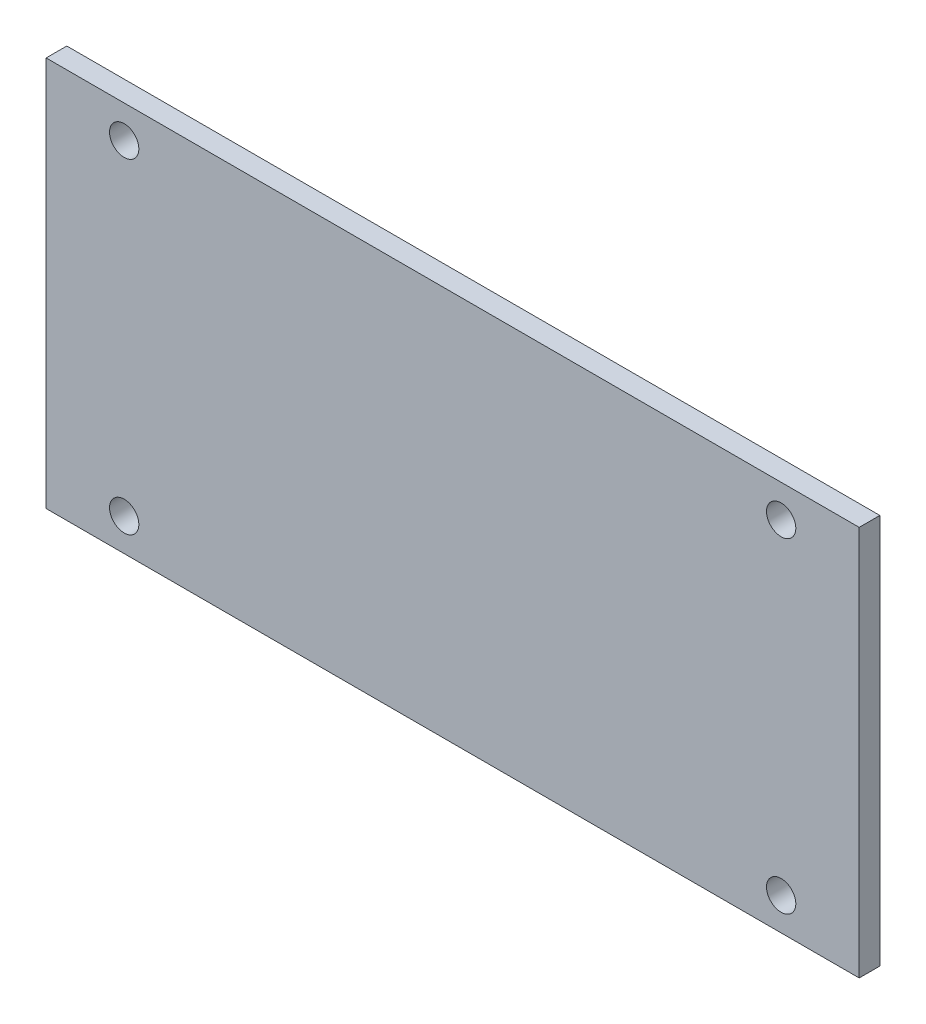
ISO-10303-21;
HEADER;
FILE_DESCRIPTION(('STEP AP214'),'2;1');
FILE_NAME('part.step','',(''),(''),'','','');
FILE_SCHEMA(('AUTOMOTIVE_DESIGN { 1 0 10303 214 1 1 1 1 }'));
ENDSEC;
DATA;
#1=APPLICATION_CONTEXT('core data for automotive mechanical design processes');
#2=APPLICATION_PROTOCOL_DEFINITION('international standard','automotive_design',2000,#1);
#3=PRODUCT_CONTEXT('',#1,'mechanical');
#4=PRODUCT('Part','Part','',(#3));
#5=PRODUCT_RELATED_PRODUCT_CATEGORY('part','',(#4));
#6=PRODUCT_DEFINITION_FORMATION('','',#4);
#7=PRODUCT_DEFINITION_CONTEXT('part definition',#1,'design');
#8=PRODUCT_DEFINITION('design','',#6,#7);
#9=PRODUCT_DEFINITION_SHAPE('','',#8);
#10=(LENGTH_UNIT() NAMED_UNIT(*) SI_UNIT(.MILLI.,.METRE.));
#11=(NAMED_UNIT(*) PLANE_ANGLE_UNIT() SI_UNIT($,.RADIAN.));
#12=(NAMED_UNIT(*) SI_UNIT($,.STERADIAN.) SOLID_ANGLE_UNIT());
#13=UNCERTAINTY_MEASURE_WITH_UNIT(LENGTH_MEASURE(1.E-05),#10,'distance_accuracy_value','');
#14=(GEOMETRIC_REPRESENTATION_CONTEXT(3) GLOBAL_UNCERTAINTY_ASSIGNED_CONTEXT((#13)) GLOBAL_UNIT_ASSIGNED_CONTEXT((#10,
#11,#12)) REPRESENTATION_CONTEXT('',''));
#15=CARTESIAN_POINT('',(0.,0.,0.));
#16=DIRECTION('',(0.,0.,1.));
#17=DIRECTION('',(1.,0.,0.));
#18=AXIS2_PLACEMENT_3D('',#15,#16,#17);
#19=CARTESIAN_POINT('',(-62.5,-30.,3.175));
#20=DIRECTION('',(1.,0.,0.));
#21=DIRECTION('',(0.,0.,-1.));
#22=AXIS2_PLACEMENT_3D('',#19,#20,#21);
#23=PLANE('',#22);
#24=DIRECTION('',(0.,-1.,0.));
#25=VECTOR('',#24,1.);
#26=CARTESIAN_POINT('',(-62.5,-30.,0.));
#27=LINE('',#26,#25);
#28=CARTESIAN_POINT('',(-62.5,30.,0.));
#29=VERTEX_POINT('',#28);
#30=CARTESIAN_POINT('',(-62.5,-30.,0.));
#31=VERTEX_POINT('',#30);
#32=EDGE_CURVE('E100',#29,#31,#27,.T.);
#33=ORIENTED_EDGE('',*,*,#32,.T.);
#34=DIRECTION('',(0.,0.,-1.));
#35=VECTOR('',#34,1.);
#36=CARTESIAN_POINT('',(-62.5,-30.,3.175));
#37=LINE('',#36,#35);
#38=CARTESIAN_POINT('',(-62.5,-30.,3.175));
#39=VERTEX_POINT('',#38);
#40=EDGE_CURVE('E11',#39,#31,#37,.T.);
#41=ORIENTED_EDGE('',*,*,#40,.F.);
#42=DIRECTION('',(0.,-1.,0.));
#43=VECTOR('',#42,1.);
#44=CARTESIAN_POINT('',(-62.5,-30.,3.175));
#45=LINE('',#44,#43);
#46=CARTESIAN_POINT('',(-62.5,30.,3.175));
#47=VERTEX_POINT('',#46);
#48=EDGE_CURVE('E88',#47,#39,#45,.T.);
#49=ORIENTED_EDGE('',*,*,#48,.F.);
#50=DIRECTION('',(0.,0.,-1.));
#51=VECTOR('',#50,1.);
#52=CARTESIAN_POINT('',(-62.5,30.,3.175));
#53=LINE('',#52,#51);
#54=EDGE_CURVE('E96',#47,#29,#53,.T.);
#55=ORIENTED_EDGE('',*,*,#54,.T.);
#56=EDGE_LOOP('',(#33,#41,#49,#55));
#57=FACE_BOUND('',#56,.T.);
#58=ADVANCED_FACE('F37',(#57),#23,.F.);
#59=CARTESIAN_POINT('',(62.5,-30.,3.175));
#60=DIRECTION('',(0.,1.,0.));
#61=DIRECTION('',(-1.,0.,0.));
#62=AXIS2_PLACEMENT_3D('',#59,#60,#61);
#63=PLANE('',#62);
#64=DIRECTION('',(1.,0.,0.));
#65=VECTOR('',#64,1.);
#66=CARTESIAN_POINT('',(62.5,-30.,0.));
#67=LINE('',#66,#65);
#68=CARTESIAN_POINT('',(62.5,-30.,0.));
#69=VERTEX_POINT('',#68);
#70=EDGE_CURVE('E92',#31,#69,#67,.T.);
#71=ORIENTED_EDGE('',*,*,#70,.T.);
#72=DIRECTION('',(0.,0.,-1.));
#73=VECTOR('',#72,1.);
#74=CARTESIAN_POINT('',(62.5,-30.,3.175));
#75=LINE('',#74,#73);
#76=CARTESIAN_POINT('',(62.5,-30.,3.175));
#77=VERTEX_POINT('',#76);
#78=EDGE_CURVE('E45',#77,#69,#75,.T.);
#79=ORIENTED_EDGE('',*,*,#78,.F.);
#80=DIRECTION('',(1.,0.,0.));
#81=VECTOR('',#80,1.);
#82=CARTESIAN_POINT('',(62.5,-30.,3.175));
#83=LINE('',#82,#81);
#84=EDGE_CURVE('E83',#39,#77,#83,.T.);
#85=ORIENTED_EDGE('',*,*,#84,.F.);
#86=ORIENTED_EDGE('',*,*,#40,.T.);
#87=EDGE_LOOP('',(#71,#79,#85,#86));
#88=FACE_BOUND('',#87,.T.);
#89=ADVANCED_FACE('F91',(#88),#63,.F.);
#90=CARTESIAN_POINT('',(62.5,-30.,3.175));
#91=DIRECTION('',(-1.,0.,0.));
#92=DIRECTION('',(0.,0.,1.));
#93=AXIS2_PLACEMENT_3D('',#90,#91,#92);
#94=PLANE('',#93);
#95=DIRECTION('',(0.,1.,0.));
#96=VECTOR('',#95,1.);
#97=CARTESIAN_POINT('',(62.5,-30.,0.));
#98=LINE('',#97,#96);
#99=CARTESIAN_POINT('',(62.5,30.,0.));
#100=VERTEX_POINT('',#99);
#101=EDGE_CURVE('E70',#69,#100,#98,.T.);
#102=ORIENTED_EDGE('',*,*,#101,.T.);
#103=DIRECTION('',(0.,0.,-1.));
#104=VECTOR('',#103,1.);
#105=CARTESIAN_POINT('',(62.5,30.,3.175));
#106=LINE('',#105,#104);
#107=CARTESIAN_POINT('',(62.5,30.,3.175));
#108=VERTEX_POINT('',#107);
#109=EDGE_CURVE('E93',#108,#100,#106,.T.);
#110=ORIENTED_EDGE('',*,*,#109,.F.);
#111=DIRECTION('',(0.,1.,0.));
#112=VECTOR('',#111,1.);
#113=CARTESIAN_POINT('',(62.5,-30.,3.175));
#114=LINE('',#113,#112);
#115=EDGE_CURVE('E86',#77,#108,#114,.T.);
#116=ORIENTED_EDGE('',*,*,#115,.F.);
#117=ORIENTED_EDGE('',*,*,#78,.T.);
#118=EDGE_LOOP('',(#102,#110,#116,#117));
#119=FACE_BOUND('',#118,.T.);
#120=ADVANCED_FACE('F94',(#119),#94,.F.);
#121=CARTESIAN_POINT('',(62.5,30.,3.175));
#122=DIRECTION('',(0.,-1.,0.));
#123=DIRECTION('',(1.,0.,0.));
#124=AXIS2_PLACEMENT_3D('',#121,#122,#123);
#125=PLANE('',#124);
#126=DIRECTION('',(-1.,0.,0.));
#127=VECTOR('',#126,1.);
#128=CARTESIAN_POINT('',(62.5,30.,0.));
#129=LINE('',#128,#127);
#130=EDGE_CURVE('E76',#100,#29,#129,.T.);
#131=ORIENTED_EDGE('',*,*,#130,.T.);
#132=ORIENTED_EDGE('',*,*,#54,.F.);
#133=DIRECTION('',(-1.,0.,0.));
#134=VECTOR('',#133,1.);
#135=CARTESIAN_POINT('',(62.5,30.,3.175));
#136=LINE('',#135,#134);
#137=EDGE_CURVE('E53',#108,#47,#136,.T.);
#138=ORIENTED_EDGE('',*,*,#137,.F.);
#139=ORIENTED_EDGE('',*,*,#109,.T.);
#140=EDGE_LOOP('',(#131,#132,#138,#139));
#141=FACE_BOUND('',#140,.T.);
#142=ADVANCED_FACE('F108',(#141),#125,.F.);
#143=CARTESIAN_POINT('',(0.,0.,3.175));
#144=DIRECTION('',(0.,0.,1.));
#145=DIRECTION('',(1.,0.,0.));
#146=AXIS2_PLACEMENT_3D('',#143,#144,#145);
#147=PLANE('',#146);
#148=CARTESIAN_POINT('',(50.5,25.,3.175));
#149=DIRECTION('',(0.,0.,1.));
#150=DIRECTION('',(-1.,0.,0.));
#151=AXIS2_PLACEMENT_3D('',#148,#149,#150);
#152=CIRCLE('',#151,2.25);
#153=CARTESIAN_POINT('',(48.25,25.,3.175));
#154=VERTEX_POINT('',#153);
#155=EDGE_CURVE('E120',#154,#154,#152,.T.);
#156=ORIENTED_EDGE('',*,*,#155,.F.);
#157=EDGE_LOOP('',(#156));
#158=FACE_BOUND('',#157,.T.);
#159=CARTESIAN_POINT('',(50.5,-25.,3.175));
#160=DIRECTION('',(0.,0.,1.));
#161=DIRECTION('',(-1.,0.,0.));
#162=AXIS2_PLACEMENT_3D('',#159,#160,#161);
#163=CIRCLE('',#162,2.25);
#164=CARTESIAN_POINT('',(48.25,-25.,3.175));
#165=VERTEX_POINT('',#164);
#166=EDGE_CURVE('E126',#165,#165,#163,.T.);
#167=ORIENTED_EDGE('',*,*,#166,.F.);
#168=EDGE_LOOP('',(#167));
#169=FACE_BOUND('',#168,.T.);
#170=CARTESIAN_POINT('',(-50.5,-25.,3.175));
#171=DIRECTION('',(0.,0.,1.));
#172=DIRECTION('',(1.,0.,0.));
#173=AXIS2_PLACEMENT_3D('',#170,#171,#172);
#174=CIRCLE('',#173,2.25);
#175=CARTESIAN_POINT('',(-48.25,-25.,3.175));
#176=VERTEX_POINT('',#175);
#177=EDGE_CURVE('E132',#176,#176,#174,.T.);
#178=ORIENTED_EDGE('',*,*,#177,.F.);
#179=EDGE_LOOP('',(#178));
#180=FACE_BOUND('',#179,.T.);
#181=CARTESIAN_POINT('',(-50.5,25.,3.175));
#182=DIRECTION('',(0.,0.,1.));
#183=DIRECTION('',(1.,0.,0.));
#184=AXIS2_PLACEMENT_3D('',#181,#182,#183);
#185=CIRCLE('',#184,2.25);
#186=CARTESIAN_POINT('',(-48.25,25.,3.175));
#187=VERTEX_POINT('',#186);
#188=EDGE_CURVE('E114',#187,#187,#185,.T.);
#189=ORIENTED_EDGE('',*,*,#188,.F.);
#190=EDGE_LOOP('',(#189));
#191=FACE_BOUND('',#190,.T.);
#192=ORIENTED_EDGE('',*,*,#48,.T.);
#193=ORIENTED_EDGE('',*,*,#84,.T.);
#194=ORIENTED_EDGE('',*,*,#115,.T.);
#195=ORIENTED_EDGE('',*,*,#137,.T.);
#196=EDGE_LOOP('',(#192,#193,#194,#195));
#197=FACE_BOUND('',#196,.T.);
#198=ADVANCED_FACE('F84',(#158,#169,#180,#191,#197),#147,.T.);
#199=CARTESIAN_POINT('',(0.,0.,0.));
#200=DIRECTION('',(0.,0.,1.));
#201=DIRECTION('',(1.,0.,0.));
#202=AXIS2_PLACEMENT_3D('',#199,#200,#201);
#203=PLANE('',#202);
#204=CARTESIAN_POINT('',(50.5,25.,0.));
#205=DIRECTION('',(0.,0.,1.));
#206=DIRECTION('',(-1.,0.,0.));
#207=AXIS2_PLACEMENT_3D('',#204,#205,#206);
#208=CIRCLE('',#207,2.25);
#209=CARTESIAN_POINT('',(48.25,25.,0.));
#210=VERTEX_POINT('',#209);
#211=EDGE_CURVE('E123',#210,#210,#208,.T.);
#212=ORIENTED_EDGE('',*,*,#211,.T.);
#213=EDGE_LOOP('',(#212));
#214=FACE_BOUND('',#213,.T.);
#215=CARTESIAN_POINT('',(50.5,-25.,0.));
#216=DIRECTION('',(0.,0.,1.));
#217=DIRECTION('',(-1.,0.,0.));
#218=AXIS2_PLACEMENT_3D('',#215,#216,#217);
#219=CIRCLE('',#218,2.25);
#220=CARTESIAN_POINT('',(48.25,-25.,0.));
#221=VERTEX_POINT('',#220);
#222=EDGE_CURVE('E129',#221,#221,#219,.T.);
#223=ORIENTED_EDGE('',*,*,#222,.T.);
#224=EDGE_LOOP('',(#223));
#225=FACE_BOUND('',#224,.T.);
#226=CARTESIAN_POINT('',(-50.5,-25.,0.));
#227=DIRECTION('',(0.,0.,1.));
#228=DIRECTION('',(1.,0.,0.));
#229=AXIS2_PLACEMENT_3D('',#226,#227,#228);
#230=CIRCLE('',#229,2.25);
#231=CARTESIAN_POINT('',(-48.25,-25.,0.));
#232=VERTEX_POINT('',#231);
#233=EDGE_CURVE('E117',#232,#232,#230,.T.);
#234=ORIENTED_EDGE('',*,*,#233,.T.);
#235=EDGE_LOOP('',(#234));
#236=FACE_BOUND('',#235,.T.);
#237=CARTESIAN_POINT('',(-50.5,25.,0.));
#238=DIRECTION('',(0.,0.,1.));
#239=DIRECTION('',(1.,0.,0.));
#240=AXIS2_PLACEMENT_3D('',#237,#238,#239);
#241=CIRCLE('',#240,2.25);
#242=CARTESIAN_POINT('',(-48.25,25.,0.));
#243=VERTEX_POINT('',#242);
#244=EDGE_CURVE('E103',#243,#243,#241,.T.);
#245=ORIENTED_EDGE('',*,*,#244,.T.);
#246=EDGE_LOOP('',(#245));
#247=FACE_BOUND('',#246,.T.);
#248=ORIENTED_EDGE('',*,*,#32,.F.);
#249=ORIENTED_EDGE('',*,*,#130,.F.);
#250=ORIENTED_EDGE('',*,*,#101,.F.);
#251=ORIENTED_EDGE('',*,*,#70,.F.);
#252=EDGE_LOOP('',(#248,#249,#250,#251));
#253=FACE_BOUND('',#252,.T.);
#254=ADVANCED_FACE('F111',(#214,#225,#236,#247,#253),#203,.F.);
#255=CARTESIAN_POINT('',(-50.5,25.,0.));
#256=DIRECTION('',(0.,0.,1.));
#257=DIRECTION('',(1.,0.,0.));
#258=AXIS2_PLACEMENT_3D('',#255,#256,#257);
#259=CYLINDRICAL_SURFACE('',#258,2.25);
#260=ORIENTED_EDGE('',*,*,#244,.F.);
#261=EDGE_LOOP('',(#260));
#262=FACE_BOUND('',#261,.T.);
#263=ORIENTED_EDGE('',*,*,#188,.T.);
#264=EDGE_LOOP('',(#263));
#265=FACE_BOUND('',#264,.T.);
#266=ADVANCED_FACE('F144',(#262,#265),#259,.F.);
#267=CARTESIAN_POINT('',(-50.5,-25.,0.));
#268=DIRECTION('',(0.,0.,1.));
#269=DIRECTION('',(1.,0.,0.));
#270=AXIS2_PLACEMENT_3D('',#267,#268,#269);
#271=CYLINDRICAL_SURFACE('',#270,2.25);
#272=ORIENTED_EDGE('',*,*,#233,.F.);
#273=EDGE_LOOP('',(#272));
#274=FACE_BOUND('',#273,.T.);
#275=ORIENTED_EDGE('',*,*,#177,.T.);
#276=EDGE_LOOP('',(#275));
#277=FACE_BOUND('',#276,.T.);
#278=ADVANCED_FACE('F140',(#274,#277),#271,.F.);
#279=CARTESIAN_POINT('',(50.5,-25.,0.));
#280=DIRECTION('',(0.,0.,1.));
#281=DIRECTION('',(1.,0.,0.));
#282=AXIS2_PLACEMENT_3D('',#279,#280,#281);
#283=CYLINDRICAL_SURFACE('',#282,2.25);
#284=ORIENTED_EDGE('',*,*,#222,.F.);
#285=EDGE_LOOP('',(#284));
#286=FACE_BOUND('',#285,.T.);
#287=ORIENTED_EDGE('',*,*,#166,.T.);
#288=EDGE_LOOP('',(#287));
#289=FACE_BOUND('',#288,.T.);
#290=ADVANCED_FACE('F143',(#286,#289),#283,.F.);
#291=CARTESIAN_POINT('',(50.5,25.,0.));
#292=DIRECTION('',(0.,0.,1.));
#293=DIRECTION('',(1.,0.,0.));
#294=AXIS2_PLACEMENT_3D('',#291,#292,#293);
#295=CYLINDRICAL_SURFACE('',#294,2.25);
#296=ORIENTED_EDGE('',*,*,#211,.F.);
#297=EDGE_LOOP('',(#296));
#298=FACE_BOUND('',#297,.T.);
#299=ORIENTED_EDGE('',*,*,#155,.T.);
#300=EDGE_LOOP('',(#299));
#301=FACE_BOUND('',#300,.T.);
#302=ADVANCED_FACE('F205',(#298,#301),#295,.F.);
#303=CLOSED_SHELL('',(#58,#89,#120,#142,#198,#254,#266,#278,#290,#302));
#304=MANIFOLD_SOLID_BREP('B2',#303);
#305=ADVANCED_BREP_SHAPE_REPRESENTATION('',(#18,#304),#14);
#306=SHAPE_DEFINITION_REPRESENTATION(#9,#305);
ENDSEC;
END-ISO-10303-21;
